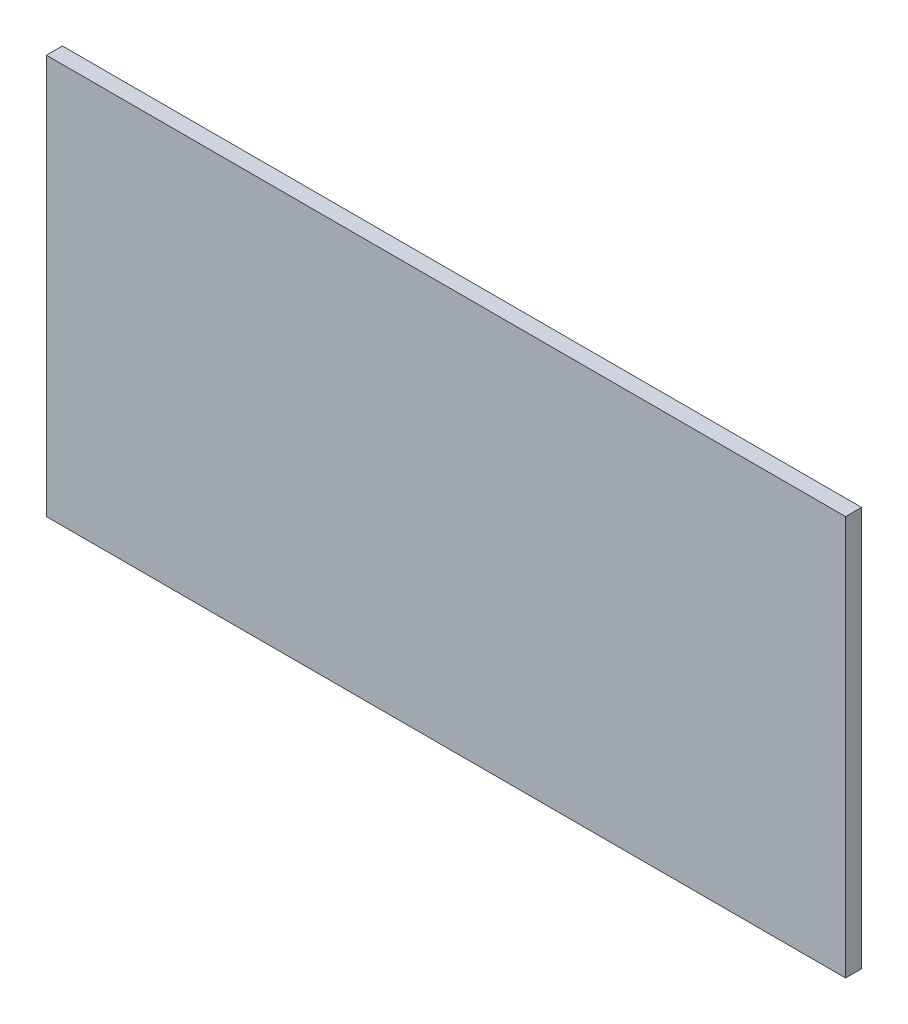
ISO-10303-21;
HEADER;
FILE_DESCRIPTION(('STEP AP214'),'2;1');
FILE_NAME('part.step','',(''),(''),'','','');
FILE_SCHEMA(('AUTOMOTIVE_DESIGN { 1 0 10303 214 1 1 1 1 }'));
ENDSEC;
DATA;
#1=APPLICATION_CONTEXT('core data for automotive mechanical design processes');
#2=APPLICATION_PROTOCOL_DEFINITION('international standard','automotive_design',2000,#1);
#3=PRODUCT_CONTEXT('',#1,'mechanical');
#4=PRODUCT('Part','Part','',(#3));
#5=PRODUCT_RELATED_PRODUCT_CATEGORY('part','',(#4));
#6=PRODUCT_DEFINITION_FORMATION('','',#4);
#7=PRODUCT_DEFINITION_CONTEXT('part definition',#1,'design');
#8=PRODUCT_DEFINITION('design','',#6,#7);
#9=PRODUCT_DEFINITION_SHAPE('','',#8);
#10=(LENGTH_UNIT() NAMED_UNIT(*) SI_UNIT(.MILLI.,.METRE.));
#11=(NAMED_UNIT(*) PLANE_ANGLE_UNIT() SI_UNIT($,.RADIAN.));
#12=(NAMED_UNIT(*) SI_UNIT($,.STERADIAN.) SOLID_ANGLE_UNIT());
#13=UNCERTAINTY_MEASURE_WITH_UNIT(LENGTH_MEASURE(1.E-05),#10,'distance_accuracy_value','');
#14=(GEOMETRIC_REPRESENTATION_CONTEXT(3) GLOBAL_UNCERTAINTY_ASSIGNED_CONTEXT((#13)) GLOBAL_UNIT_ASSIGNED_CONTEXT((#10,
#11,#12)) REPRESENTATION_CONTEXT('',''));
#15=CARTESIAN_POINT('',(0.,0.,0.));
#16=DIRECTION('',(0.,0.,1.));
#17=DIRECTION('',(1.,0.,0.));
#18=AXIS2_PLACEMENT_3D('',#15,#16,#17);
#19=CARTESIAN_POINT('',(-100.,-50.,4.));
#20=DIRECTION('',(1.,0.,0.));
#21=DIRECTION('',(0.,0.,-1.));
#22=AXIS2_PLACEMENT_3D('',#19,#20,#21);
#23=PLANE('',#22);
#24=DIRECTION('',(0.,-1.,0.));
#25=VECTOR('',#24,1.);
#26=CARTESIAN_POINT('',(-100.,-50.,0.));
#27=LINE('',#26,#25);
#28=CARTESIAN_POINT('',(-100.,50.,0.));
#29=VERTEX_POINT('',#28);
#30=CARTESIAN_POINT('',(-100.,-50.,0.));
#31=VERTEX_POINT('',#30);
#32=EDGE_CURVE('E104',#29,#31,#27,.T.);
#33=ORIENTED_EDGE('',*,*,#32,.T.);
#34=DIRECTION('',(0.,0.,-1.));
#35=VECTOR('',#34,1.);
#36=CARTESIAN_POINT('',(-100.,-50.,4.));
#37=LINE('',#36,#35);
#38=CARTESIAN_POINT('',(-100.,-50.,4.));
#39=VERTEX_POINT('',#38);
#40=EDGE_CURVE('E11',#39,#31,#37,.T.);
#41=ORIENTED_EDGE('',*,*,#40,.F.);
#42=DIRECTION('',(0.,-1.,0.));
#43=VECTOR('',#42,1.);
#44=CARTESIAN_POINT('',(-100.,-50.,4.));
#45=LINE('',#44,#43);
#46=CARTESIAN_POINT('',(-100.,50.,4.));
#47=VERTEX_POINT('',#46);
#48=EDGE_CURVE('E92',#47,#39,#45,.T.);
#49=ORIENTED_EDGE('',*,*,#48,.F.);
#50=DIRECTION('',(0.,0.,-1.));
#51=VECTOR('',#50,1.);
#52=CARTESIAN_POINT('',(-100.,50.,4.));
#53=LINE('',#52,#51);
#54=EDGE_CURVE('E100',#47,#29,#53,.T.);
#55=ORIENTED_EDGE('',*,*,#54,.T.);
#56=EDGE_LOOP('',(#33,#41,#49,#55));
#57=FACE_BOUND('',#56,.T.);
#58=ADVANCED_FACE('F41',(#57),#23,.F.);
#59=CARTESIAN_POINT('',(-100.,-50.,4.));
#60=DIRECTION('',(0.,1.,0.));
#61=DIRECTION('',(0.,0.,1.));
#62=AXIS2_PLACEMENT_3D('',#59,#60,#61);
#63=PLANE('',#62);
#64=DIRECTION('',(1.,0.,0.));
#65=VECTOR('',#64,1.);
#66=CARTESIAN_POINT('',(-100.,-50.,0.));
#67=LINE('',#66,#65);
#68=CARTESIAN_POINT('',(100.,-50.,0.));
#69=VERTEX_POINT('',#68);
#70=EDGE_CURVE('E96',#31,#69,#67,.T.);
#71=ORIENTED_EDGE('',*,*,#70,.T.);
#72=DIRECTION('',(0.,0.,-1.));
#73=VECTOR('',#72,1.);
#74=CARTESIAN_POINT('',(100.,-50.,4.));
#75=LINE('',#74,#73);
#76=CARTESIAN_POINT('',(100.,-50.,4.));
#77=VERTEX_POINT('',#76);
#78=EDGE_CURVE('E49',#77,#69,#75,.T.);
#79=ORIENTED_EDGE('',*,*,#78,.F.);
#80=DIRECTION('',(1.,0.,0.));
#81=VECTOR('',#80,1.);
#82=CARTESIAN_POINT('',(-100.,-50.,4.));
#83=LINE('',#82,#81);
#84=EDGE_CURVE('E87',#39,#77,#83,.T.);
#85=ORIENTED_EDGE('',*,*,#84,.F.);
#86=ORIENTED_EDGE('',*,*,#40,.T.);
#87=EDGE_LOOP('',(#71,#79,#85,#86));
#88=FACE_BOUND('',#87,.T.);
#89=ADVANCED_FACE('F95',(#88),#63,.F.);
#90=CARTESIAN_POINT('',(100.,-50.,4.));
#91=DIRECTION('',(-1.,0.,0.));
#92=DIRECTION('',(0.,0.,1.));
#93=AXIS2_PLACEMENT_3D('',#90,#91,#92);
#94=PLANE('',#93);
#95=DIRECTION('',(0.,1.,0.));
#96=VECTOR('',#95,1.);
#97=CARTESIAN_POINT('',(100.,-50.,0.));
#98=LINE('',#97,#96);
#99=CARTESIAN_POINT('',(100.,50.,0.));
#100=VERTEX_POINT('',#99);
#101=EDGE_CURVE('E74',#69,#100,#98,.T.);
#102=ORIENTED_EDGE('',*,*,#101,.T.);
#103=DIRECTION('',(0.,0.,-1.));
#104=VECTOR('',#103,1.);
#105=CARTESIAN_POINT('',(100.,50.,4.));
#106=LINE('',#105,#104);
#107=CARTESIAN_POINT('',(100.,50.,4.));
#108=VERTEX_POINT('',#107);
#109=EDGE_CURVE('E97',#108,#100,#106,.T.);
#110=ORIENTED_EDGE('',*,*,#109,.F.);
#111=DIRECTION('',(0.,1.,0.));
#112=VECTOR('',#111,1.);
#113=CARTESIAN_POINT('',(100.,-50.,4.));
#114=LINE('',#113,#112);
#115=EDGE_CURVE('E90',#77,#108,#114,.T.);
#116=ORIENTED_EDGE('',*,*,#115,.F.);
#117=ORIENTED_EDGE('',*,*,#78,.T.);
#118=EDGE_LOOP('',(#102,#110,#116,#117));
#119=FACE_BOUND('',#118,.T.);
#120=ADVANCED_FACE('F98',(#119),#94,.F.);
#121=CARTESIAN_POINT('',(-100.,50.,4.));
#122=DIRECTION('',(0.,-1.,0.));
#123=DIRECTION('',(0.,0.,-1.));
#124=AXIS2_PLACEMENT_3D('',#121,#122,#123);
#125=PLANE('',#124);
#126=DIRECTION('',(-1.,0.,0.));
#127=VECTOR('',#126,1.);
#128=CARTESIAN_POINT('',(-100.,50.,0.));
#129=LINE('',#128,#127);
#130=EDGE_CURVE('E80',#100,#29,#129,.T.);
#131=ORIENTED_EDGE('',*,*,#130,.T.);
#132=ORIENTED_EDGE('',*,*,#54,.F.);
#133=DIRECTION('',(-1.,0.,0.));
#134=VECTOR('',#133,1.);
#135=CARTESIAN_POINT('',(-100.,50.,4.));
#136=LINE('',#135,#134);
#137=EDGE_CURVE('E57',#108,#47,#136,.T.);
#138=ORIENTED_EDGE('',*,*,#137,.F.);
#139=ORIENTED_EDGE('',*,*,#109,.T.);
#140=EDGE_LOOP('',(#131,#132,#138,#139));
#141=FACE_BOUND('',#140,.T.);
#142=ADVANCED_FACE('F111',(#141),#125,.F.);
#143=CARTESIAN_POINT('',(0.,0.,4.));
#144=DIRECTION('',(0.,0.,-1.));
#145=DIRECTION('',(-1.,0.,0.));
#146=AXIS2_PLACEMENT_3D('',#143,#144,#145);
#147=PLANE('',#146);
#148=ORIENTED_EDGE('',*,*,#48,.T.);
#149=ORIENTED_EDGE('',*,*,#84,.T.);
#150=ORIENTED_EDGE('',*,*,#115,.T.);
#151=ORIENTED_EDGE('',*,*,#137,.T.);
#152=EDGE_LOOP('',(#148,#149,#150,#151));
#153=FACE_BOUND('',#152,.T.);
#154=ADVANCED_FACE('F88',(#153),#147,.F.);
#155=CARTESIAN_POINT('',(0.,0.,0.));
#156=DIRECTION('',(0.,0.,-1.));
#157=DIRECTION('',(-1.,0.,0.));
#158=AXIS2_PLACEMENT_3D('',#155,#156,#157);
#159=PLANE('',#158);
#160=ORIENTED_EDGE('',*,*,#32,.F.);
#161=ORIENTED_EDGE('',*,*,#130,.F.);
#162=ORIENTED_EDGE('',*,*,#101,.F.);
#163=ORIENTED_EDGE('',*,*,#70,.F.);
#164=EDGE_LOOP('',(#160,#161,#162,#163));
#165=FACE_BOUND('',#164,.T.);
#166=ADVANCED_FACE('F114',(#165),#159,.T.);
#167=CLOSED_SHELL('',(#58,#89,#120,#142,#154,#166));
#168=MANIFOLD_SOLID_BREP('B2',#167);
#169=ADVANCED_BREP_SHAPE_REPRESENTATION('',(#18,#168),#14);
#170=SHAPE_DEFINITION_REPRESENTATION(#9,#169);
ENDSEC;
END-ISO-10303-21;
